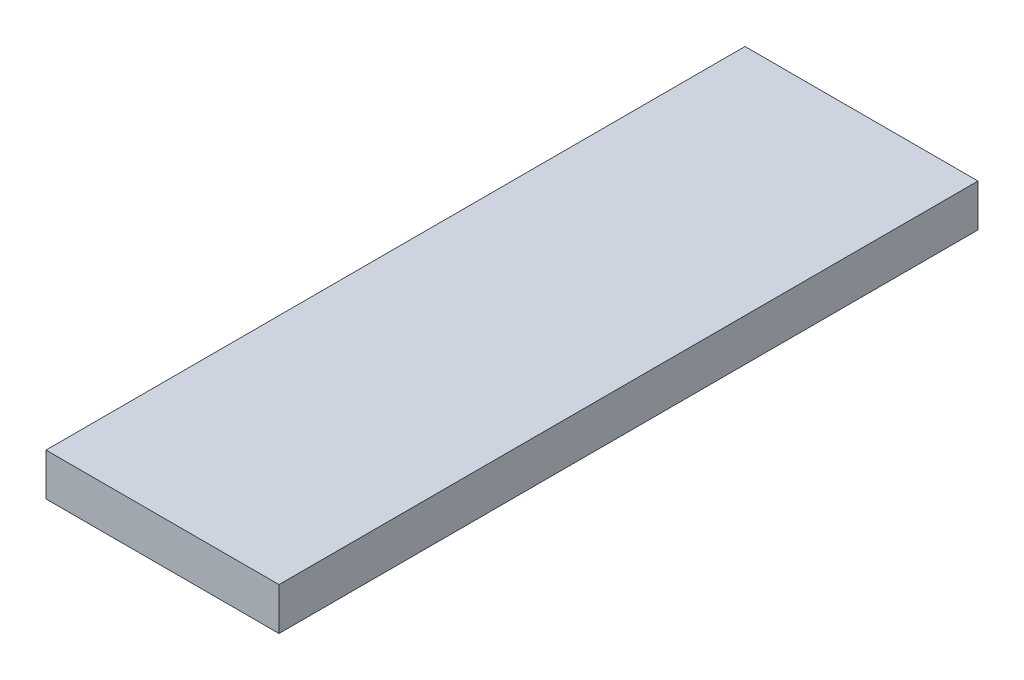
ISO-10303-21;
HEADER;
FILE_DESCRIPTION(('STEP AP214'),'2;1');
FILE_NAME('part.step','',(''),(''),'','','');
FILE_SCHEMA(('AUTOMOTIVE_DESIGN { 1 0 10303 214 1 1 1 1 }'));
ENDSEC;
DATA;
#1=APPLICATION_CONTEXT('core data for automotive mechanical design processes');
#2=APPLICATION_PROTOCOL_DEFINITION('international standard','automotive_design',2000,#1);
#3=PRODUCT_CONTEXT('',#1,'mechanical');
#4=PRODUCT('Part','Part','',(#3));
#5=PRODUCT_RELATED_PRODUCT_CATEGORY('part','',(#4));
#6=PRODUCT_DEFINITION_FORMATION('','',#4);
#7=PRODUCT_DEFINITION_CONTEXT('part definition',#1,'design');
#8=PRODUCT_DEFINITION('design','',#6,#7);
#9=PRODUCT_DEFINITION_SHAPE('','',#8);
#10=(LENGTH_UNIT() NAMED_UNIT(*) SI_UNIT(.MILLI.,.METRE.));
#11=(NAMED_UNIT(*) PLANE_ANGLE_UNIT() SI_UNIT($,.RADIAN.));
#12=(NAMED_UNIT(*) SI_UNIT($,.STERADIAN.) SOLID_ANGLE_UNIT());
#13=UNCERTAINTY_MEASURE_WITH_UNIT(LENGTH_MEASURE(1.E-05),#10,'distance_accuracy_value','');
#14=(GEOMETRIC_REPRESENTATION_CONTEXT(3) GLOBAL_UNCERTAINTY_ASSIGNED_CONTEXT((#13)) GLOBAL_UNIT_ASSIGNED_CONTEXT((#10,
#11,#12)) REPRESENTATION_CONTEXT('',''));
#15=CARTESIAN_POINT('',(0.,0.,0.));
#16=DIRECTION('',(0.,0.,1.));
#17=DIRECTION('',(1.,0.,0.));
#18=AXIS2_PLACEMENT_3D('',#15,#16,#17);
#19=CARTESIAN_POINT('',(0.,10.,0.));
#20=DIRECTION('',(1.,0.,0.));
#21=DIRECTION('',(0.,0.,-1.));
#22=AXIS2_PLACEMENT_3D('',#19,#20,#21);
#23=PLANE('',#22);
#24=DIRECTION('',(0.,0.,1.));
#25=VECTOR('',#24,1.);
#26=CARTESIAN_POINT('',(0.,0.,0.));
#27=LINE('',#26,#25);
#28=CARTESIAN_POINT('',(0.,0.,-165.));
#29=VERTEX_POINT('',#28);
#30=CARTESIAN_POINT('',(0.,0.,0.));
#31=VERTEX_POINT('',#30);
#32=EDGE_CURVE('E95',#29,#31,#27,.T.);
#33=ORIENTED_EDGE('',*,*,#32,.T.);
#34=DIRECTION('',(0.,-1.,0.));
#35=VECTOR('',#34,1.);
#36=CARTESIAN_POINT('',(0.,10.,0.));
#37=LINE('',#36,#35);
#38=CARTESIAN_POINT('',(0.,10.,0.));
#39=VERTEX_POINT('',#38);
#40=EDGE_CURVE('E11',#39,#31,#37,.T.);
#41=ORIENTED_EDGE('',*,*,#40,.F.);
#42=DIRECTION('',(0.,0.,1.));
#43=VECTOR('',#42,1.);
#44=CARTESIAN_POINT('',(0.,10.,0.));
#45=LINE('',#44,#43);
#46=CARTESIAN_POINT('',(0.,10.,-165.));
#47=VERTEX_POINT('',#46);
#48=EDGE_CURVE('E83',#47,#39,#45,.T.);
#49=ORIENTED_EDGE('',*,*,#48,.F.);
#50=DIRECTION('',(0.,-1.,0.));
#51=VECTOR('',#50,1.);
#52=CARTESIAN_POINT('',(0.,10.,-165.));
#53=LINE('',#52,#51);
#54=EDGE_CURVE('E91',#47,#29,#53,.T.);
#55=ORIENTED_EDGE('',*,*,#54,.T.);
#56=EDGE_LOOP('',(#33,#41,#49,#55));
#57=FACE_BOUND('',#56,.T.);
#58=ADVANCED_FACE('F32',(#57),#23,.F.);
#59=CARTESIAN_POINT('',(0.,10.,0.));
#60=DIRECTION('',(0.,0.,-1.));
#61=DIRECTION('',(-1.,0.,0.));
#62=AXIS2_PLACEMENT_3D('',#59,#60,#61);
#63=PLANE('',#62);
#64=DIRECTION('',(1.,0.,0.));
#65=VECTOR('',#64,1.);
#66=CARTESIAN_POINT('',(0.,0.,0.));
#67=LINE('',#66,#65);
#68=CARTESIAN_POINT('',(55.,0.,0.));
#69=VERTEX_POINT('',#68);
#70=EDGE_CURVE('E87',#31,#69,#67,.T.);
#71=ORIENTED_EDGE('',*,*,#70,.T.);
#72=DIRECTION('',(0.,-1.,0.));
#73=VECTOR('',#72,1.);
#74=CARTESIAN_POINT('',(55.,10.,0.));
#75=LINE('',#74,#73);
#76=CARTESIAN_POINT('',(55.,10.,0.));
#77=VERTEX_POINT('',#76);
#78=EDGE_CURVE('E40',#77,#69,#75,.T.);
#79=ORIENTED_EDGE('',*,*,#78,.F.);
#80=DIRECTION('',(1.,0.,0.));
#81=VECTOR('',#80,1.);
#82=CARTESIAN_POINT('',(0.,10.,0.));
#83=LINE('',#82,#81);
#84=EDGE_CURVE('E78',#39,#77,#83,.T.);
#85=ORIENTED_EDGE('',*,*,#84,.F.);
#86=ORIENTED_EDGE('',*,*,#40,.T.);
#87=EDGE_LOOP('',(#71,#79,#85,#86));
#88=FACE_BOUND('',#87,.T.);
#89=ADVANCED_FACE('F86',(#88),#63,.F.);
#90=CARTESIAN_POINT('',(55.,10.,0.));
#91=DIRECTION('',(-1.,0.,0.));
#92=DIRECTION('',(0.,0.,1.));
#93=AXIS2_PLACEMENT_3D('',#90,#91,#92);
#94=PLANE('',#93);
#95=DIRECTION('',(0.,0.,-1.));
#96=VECTOR('',#95,1.);
#97=CARTESIAN_POINT('',(55.,0.,0.));
#98=LINE('',#97,#96);
#99=CARTESIAN_POINT('',(55.,0.,-165.));
#100=VERTEX_POINT('',#99);
#101=EDGE_CURVE('E65',#69,#100,#98,.T.);
#102=ORIENTED_EDGE('',*,*,#101,.T.);
#103=DIRECTION('',(0.,-1.,0.));
#104=VECTOR('',#103,1.);
#105=CARTESIAN_POINT('',(55.,10.,-165.));
#106=LINE('',#105,#104);
#107=CARTESIAN_POINT('',(55.,10.,-165.));
#108=VERTEX_POINT('',#107);
#109=EDGE_CURVE('E88',#108,#100,#106,.T.);
#110=ORIENTED_EDGE('',*,*,#109,.F.);
#111=DIRECTION('',(0.,0.,-1.));
#112=VECTOR('',#111,1.);
#113=CARTESIAN_POINT('',(55.,10.,0.));
#114=LINE('',#113,#112);
#115=EDGE_CURVE('E81',#77,#108,#114,.T.);
#116=ORIENTED_EDGE('',*,*,#115,.F.);
#117=ORIENTED_EDGE('',*,*,#78,.T.);
#118=EDGE_LOOP('',(#102,#110,#116,#117));
#119=FACE_BOUND('',#118,.T.);
#120=ADVANCED_FACE('F89',(#119),#94,.F.);
#121=CARTESIAN_POINT('',(0.,10.,-165.));
#122=DIRECTION('',(0.,0.,1.));
#123=DIRECTION('',(1.,0.,0.));
#124=AXIS2_PLACEMENT_3D('',#121,#122,#123);
#125=PLANE('',#124);
#126=DIRECTION('',(-1.,0.,0.));
#127=VECTOR('',#126,1.);
#128=CARTESIAN_POINT('',(0.,0.,-165.));
#129=LINE('',#128,#127);
#130=EDGE_CURVE('E71',#100,#29,#129,.T.);
#131=ORIENTED_EDGE('',*,*,#130,.T.);
#132=ORIENTED_EDGE('',*,*,#54,.F.);
#133=DIRECTION('',(-1.,0.,0.));
#134=VECTOR('',#133,1.);
#135=CARTESIAN_POINT('',(0.,10.,-165.));
#136=LINE('',#135,#134);
#137=EDGE_CURVE('E48',#108,#47,#136,.T.);
#138=ORIENTED_EDGE('',*,*,#137,.F.);
#139=ORIENTED_EDGE('',*,*,#109,.T.);
#140=EDGE_LOOP('',(#131,#132,#138,#139));
#141=FACE_BOUND('',#140,.T.);
#142=ADVANCED_FACE('F102',(#141),#125,.F.);
#143=CARTESIAN_POINT('',(0.,10.,0.));
#144=DIRECTION('',(0.,-1.,0.));
#145=DIRECTION('',(0.,0.,-1.));
#146=AXIS2_PLACEMENT_3D('',#143,#144,#145);
#147=PLANE('',#146);
#148=ORIENTED_EDGE('',*,*,#48,.T.);
#149=ORIENTED_EDGE('',*,*,#84,.T.);
#150=ORIENTED_EDGE('',*,*,#115,.T.);
#151=ORIENTED_EDGE('',*,*,#137,.T.);
#152=EDGE_LOOP('',(#148,#149,#150,#151));
#153=FACE_BOUND('',#152,.T.);
#154=ADVANCED_FACE('F79',(#153),#147,.F.);
#155=CARTESIAN_POINT('',(0.,0.,0.));
#156=DIRECTION('',(0.,-1.,0.));
#157=DIRECTION('',(0.,0.,-1.));
#158=AXIS2_PLACEMENT_3D('',#155,#156,#157);
#159=PLANE('',#158);
#160=ORIENTED_EDGE('',*,*,#32,.F.);
#161=ORIENTED_EDGE('',*,*,#130,.F.);
#162=ORIENTED_EDGE('',*,*,#101,.F.);
#163=ORIENTED_EDGE('',*,*,#70,.F.);
#164=EDGE_LOOP('',(#160,#161,#162,#163));
#165=FACE_BOUND('',#164,.T.);
#166=ADVANCED_FACE('F105',(#165),#159,.T.);
#167=CLOSED_SHELL('',(#58,#89,#120,#142,#154,#166));
#168=MANIFOLD_SOLID_BREP('B2',#167);
#169=ADVANCED_BREP_SHAPE_REPRESENTATION('',(#18,#168),#14);
#170=SHAPE_DEFINITION_REPRESENTATION(#9,#169);
ENDSEC;
END-ISO-10303-21;
